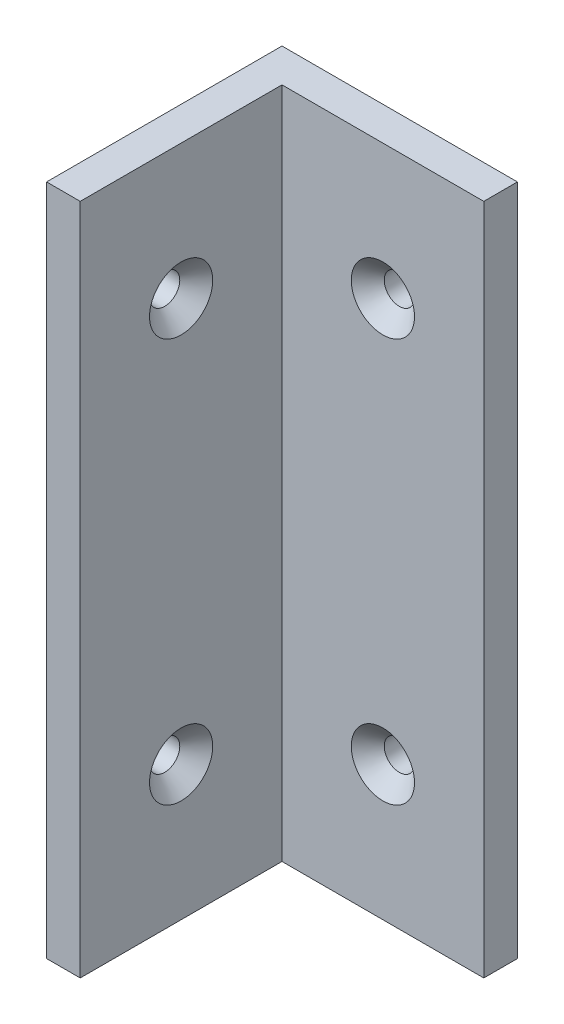
ISO-10303-21;
HEADER;
FILE_DESCRIPTION(('STEP AP214'),'2;1');
FILE_NAME('part.step','',(''),(''),'','','');
FILE_SCHEMA(('AUTOMOTIVE_DESIGN { 1 0 10303 214 1 1 1 1 }'));
ENDSEC;
DATA;
#1=APPLICATION_CONTEXT('core data for automotive mechanical design processes');
#2=APPLICATION_PROTOCOL_DEFINITION('international standard','automotive_design',2000,#1);
#3=PRODUCT_CONTEXT('',#1,'mechanical');
#4=PRODUCT('Part','Part','',(#3));
#5=PRODUCT_RELATED_PRODUCT_CATEGORY('part','',(#4));
#6=PRODUCT_DEFINITION_FORMATION('','',#4);
#7=PRODUCT_DEFINITION_CONTEXT('part definition',#1,'design');
#8=PRODUCT_DEFINITION('design','',#6,#7);
#9=PRODUCT_DEFINITION_SHAPE('','',#8);
#10=(LENGTH_UNIT() NAMED_UNIT(*) SI_UNIT(.MILLI.,.METRE.));
#11=(NAMED_UNIT(*) PLANE_ANGLE_UNIT() SI_UNIT($,.RADIAN.));
#12=(NAMED_UNIT(*) SI_UNIT($,.STERADIAN.) SOLID_ANGLE_UNIT());
#13=UNCERTAINTY_MEASURE_WITH_UNIT(LENGTH_MEASURE(1.E-05),#10,'distance_accuracy_value','');
#14=(GEOMETRIC_REPRESENTATION_CONTEXT(3) GLOBAL_UNCERTAINTY_ASSIGNED_CONTEXT((#13)) GLOBAL_UNIT_ASSIGNED_CONTEXT((#10,
#11,#12)) REPRESENTATION_CONTEXT('',''));
#15=CARTESIAN_POINT('',(0.,0.,0.));
#16=DIRECTION('',(0.,0.,1.));
#17=DIRECTION('',(1.,0.,0.));
#18=AXIS2_PLACEMENT_3D('',#15,#16,#17);
#19=CARTESIAN_POINT('',(15.,80.,4.99999999999545));
#20=DIRECTION('',(0.,0.,1.));
#21=DIRECTION('',(1.,0.,0.));
#22=AXIS2_PLACEMENT_3D('',#19,#20,#21);
#23=CONICAL_SURFACE('',#22,4.70000000000028,0.785398163409049);
#24=CARTESIAN_POINT('',(15.,80.,5.00000000000909));
#25=DIRECTION('',(0.,0.,1.));
#26=DIRECTION('',(1.,0.,0.));
#27=AXIS2_PLACEMENT_3D('',#24,#25,#26);
#28=CIRCLE('',#27,4.70000000001392);
#29=CARTESIAN_POINT('',(19.7000000000139,80.,5.00000000000909));
#30=VERTEX_POINT('',#29);
#31=EDGE_CURVE('E130',#30,#30,#28,.F.);
#32=ORIENTED_EDGE('',*,*,#31,.F.);
#33=EDGE_LOOP('',(#32));
#34=FACE_BOUND('',#33,.T.);
#35=CARTESIAN_POINT('',(15.,80.,2.54999999999999));
#36=DIRECTION('',(0.,0.,1.));
#37=DIRECTION('',(1.,0.,0.));
#38=AXIS2_PLACEMENT_3D('',#35,#36,#37);
#39=CIRCLE('',#38,2.24999999999999);
#40=CARTESIAN_POINT('',(17.25,80.,2.54999999999999));
#41=VERTEX_POINT('',#40);
#42=EDGE_CURVE('E113',#41,#41,#39,.F.);
#43=ORIENTED_EDGE('',*,*,#42,.T.);
#44=EDGE_LOOP('',(#43));
#45=FACE_BOUND('',#44,.T.);
#46=ADVANCED_FACE('F17',(#34,#45),#23,.F.);
#47=CARTESIAN_POINT('',(15.0000000000006,20.,4.99999999999545));
#48=DIRECTION('',(0.,0.,1.));
#49=DIRECTION('',(1.,0.,0.));
#50=AXIS2_PLACEMENT_3D('',#47,#48,#49);
#51=CONICAL_SURFACE('',#50,4.69999999999965,0.785398163409049);
#52=CARTESIAN_POINT('',(15.0000000000006,20.,5.00000000000972));
#53=DIRECTION('',(0.,0.,1.));
#54=DIRECTION('',(1.,0.,0.));
#55=AXIS2_PLACEMENT_3D('',#52,#53,#54);
#56=CIRCLE('',#55,4.70000000001392);
#57=CARTESIAN_POINT('',(19.7000000000145,20.,5.00000000000972));
#58=VERTEX_POINT('',#57);
#59=EDGE_CURVE('E89',#58,#58,#56,.F.);
#60=ORIENTED_EDGE('',*,*,#59,.F.);
#61=EDGE_LOOP('',(#60));
#62=FACE_BOUND('',#61,.T.);
#63=CARTESIAN_POINT('',(15.0000000000006,20.,2.54999999999999));
#64=DIRECTION('',(0.,0.,1.));
#65=DIRECTION('',(1.,0.,0.));
#66=AXIS2_PLACEMENT_3D('',#63,#64,#65);
#67=CIRCLE('',#66,2.24999999999999);
#68=CARTESIAN_POINT('',(17.2500000000006,20.,2.54999999999999));
#69=VERTEX_POINT('',#68);
#70=EDGE_CURVE('E110',#69,#69,#67,.F.);
#71=ORIENTED_EDGE('',*,*,#70,.T.);
#72=EDGE_LOOP('',(#71));
#73=FACE_BOUND('',#72,.T.);
#74=ADVANCED_FACE('F223',(#62,#73),#51,.F.);
#75=CARTESIAN_POINT('',(-5.6843418860808E-11,80.,20.));
#76=DIRECTION('',(1.,0.,0.));
#77=DIRECTION('',(0.,0.,-1.));
#78=AXIS2_PLACEMENT_3D('',#75,#76,#77);
#79=CONICAL_SURFACE('',#78,4.69999999986158,0.785398163409049);
#80=CARTESIAN_POINT('',(3.86496390425477E-11,80.,20.));
#81=DIRECTION('',(1.,0.,0.));
#82=DIRECTION('',(0.,0.,-1.));
#83=AXIS2_PLACEMENT_3D('',#80,#81,#82);
#84=CIRCLE('',#83,4.69999999995707);
#85=CARTESIAN_POINT('',(3.86496390425477E-11,80.,15.3000000000429));
#86=VERTEX_POINT('',#85);
#87=EDGE_CURVE('E20',#86,#86,#84,.T.);
#88=ORIENTED_EDGE('',*,*,#87,.T.);
#89=EDGE_LOOP('',(#88));
#90=FACE_BOUND('',#89,.T.);
#91=CARTESIAN_POINT('',(-2.45000000000001,80.,20.));
#92=DIRECTION('',(1.,0.,0.));
#93=DIRECTION('',(0.,0.,-1.));
#94=AXIS2_PLACEMENT_3D('',#91,#92,#93);
#95=CIRCLE('',#94,2.24999999999999);
#96=CARTESIAN_POINT('',(-2.45000000000001,80.,17.75));
#97=VERTEX_POINT('',#96);
#98=EDGE_CURVE('E102',#97,#97,#95,.F.);
#99=ORIENTED_EDGE('',*,*,#98,.T.);
#100=EDGE_LOOP('',(#99));
#101=FACE_BOUND('',#100,.T.);
#102=ADVANCED_FACE('F139',(#90,#101),#79,.F.);
#103=CARTESIAN_POINT('',(5.6843418860808E-11,20.,19.9999999999994));
#104=DIRECTION('',(1.,0.,0.));
#105=DIRECTION('',(0.,0.,-1.));
#106=AXIS2_PLACEMENT_3D('',#103,#104,#105);
#107=CONICAL_SURFACE('',#106,4.69999999997464,0.785398163385848);
#108=CARTESIAN_POINT('',(5.6843418860808E-11,20.,19.9999999999994));
#109=DIRECTION('',(1.,0.,0.));
#110=DIRECTION('',(0.,0.,-1.));
#111=AXIS2_PLACEMENT_3D('',#108,#109,#110);
#112=CIRCLE('',#111,4.69999999997464);
#113=CARTESIAN_POINT('',(5.6843418860808E-11,20.,15.3000000000247));
#114=VERTEX_POINT('',#113);
#115=EDGE_CURVE('E132',#114,#114,#112,.T.);
#116=ORIENTED_EDGE('',*,*,#115,.T.);
#117=EDGE_LOOP('',(#116));
#118=FACE_BOUND('',#117,.T.);
#119=CARTESIAN_POINT('',(-2.45000000000001,20.,19.9999999999994));
#120=DIRECTION('',(1.,0.,0.));
#121=DIRECTION('',(0.,0.,-1.));
#122=AXIS2_PLACEMENT_3D('',#119,#120,#121);
#123=CIRCLE('',#122,2.24999999999999);
#124=CARTESIAN_POINT('',(-2.45000000000001,20.,17.7499999999994));
#125=VERTEX_POINT('',#124);
#126=EDGE_CURVE('E104',#125,#125,#123,.F.);
#127=ORIENTED_EDGE('',*,*,#126,.T.);
#128=EDGE_LOOP('',(#127));
#129=FACE_BOUND('',#128,.T.);
#130=ADVANCED_FACE('F218',(#118,#129),#107,.F.);
#131=CARTESIAN_POINT('',(15.,80.,5.));
#132=DIRECTION('',(0.,0.,1.));
#133=DIRECTION('',(1.,0.,0.));
#134=AXIS2_PLACEMENT_3D('',#131,#132,#133);
#135=CYLINDRICAL_SURFACE('',#134,2.24999999999999);
#136=CARTESIAN_POINT('',(15.,80.,0.));
#137=DIRECTION('',(0.,0.,1.));
#138=DIRECTION('',(1.,0.,0.));
#139=AXIS2_PLACEMENT_3D('',#136,#137,#138);
#140=CIRCLE('',#139,2.24999999999999);
#141=CARTESIAN_POINT('',(17.25,80.,0.));
#142=VERTEX_POINT('',#141);
#143=EDGE_CURVE('E107',#142,#142,#140,.F.);
#144=ORIENTED_EDGE('',*,*,#143,.T.);
#145=EDGE_LOOP('',(#144));
#146=FACE_BOUND('',#145,.T.);
#147=ORIENTED_EDGE('',*,*,#42,.F.);
#148=EDGE_LOOP('',(#147));
#149=FACE_BOUND('',#148,.T.);
#150=ADVANCED_FACE('F152',(#146,#149),#135,.F.);
#151=CARTESIAN_POINT('',(15.0000000000006,20.,5.));
#152=DIRECTION('',(0.,0.,1.));
#153=DIRECTION('',(1.,0.,0.));
#154=AXIS2_PLACEMENT_3D('',#151,#152,#153);
#155=CYLINDRICAL_SURFACE('',#154,2.24999999999999);
#156=CARTESIAN_POINT('',(15.0000000000006,20.,0.));
#157=DIRECTION('',(0.,0.,1.));
#158=DIRECTION('',(1.,0.,0.));
#159=AXIS2_PLACEMENT_3D('',#156,#157,#158);
#160=CIRCLE('',#159,2.24999999999999);
#161=CARTESIAN_POINT('',(17.2500000000006,20.,0.));
#162=VERTEX_POINT('',#161);
#163=EDGE_CURVE('E101',#162,#162,#160,.F.);
#164=ORIENTED_EDGE('',*,*,#163,.T.);
#165=EDGE_LOOP('',(#164));
#166=FACE_BOUND('',#165,.T.);
#167=ORIENTED_EDGE('',*,*,#70,.F.);
#168=EDGE_LOOP('',(#167));
#169=FACE_BOUND('',#168,.T.);
#170=ADVANCED_FACE('F143',(#166,#169),#155,.F.);
#171=CARTESIAN_POINT('',(0.,0.,35.));
#172=DIRECTION('',(-1.,0.,0.));
#173=DIRECTION('',(0.,0.,1.));
#174=AXIS2_PLACEMENT_3D('',#171,#172,#173);
#175=PLANE('',#174);
#176=DIRECTION('',(0.,1.,0.));
#177=VECTOR('',#176,1.);
#178=CARTESIAN_POINT('',(0.,0.,5.));
#179=LINE('',#178,#177);
#180=CARTESIAN_POINT('',(0.,100.,5.));
#181=VERTEX_POINT('',#180);
#182=CARTESIAN_POINT('',(0.,0.,5.));
#183=VERTEX_POINT('',#182);
#184=EDGE_CURVE('E76',#181,#183,#179,.F.);
#185=ORIENTED_EDGE('',*,*,#184,.F.);
#186=DIRECTION('',(0.,0.,1.));
#187=VECTOR('',#186,1.);
#188=CARTESIAN_POINT('',(0.,100.,5.));
#189=LINE('',#188,#187);
#190=CARTESIAN_POINT('',(0.,100.,35.));
#191=VERTEX_POINT('',#190);
#192=EDGE_CURVE('E195',#191,#181,#189,.F.);
#193=ORIENTED_EDGE('',*,*,#192,.F.);
#194=DIRECTION('',(0.,1.,0.));
#195=VECTOR('',#194,1.);
#196=CARTESIAN_POINT('',(0.,0.,35.));
#197=LINE('',#196,#195);
#198=CARTESIAN_POINT('',(0.,0.,35.));
#199=VERTEX_POINT('',#198);
#200=EDGE_CURVE('E78',#199,#191,#197,.T.);
#201=ORIENTED_EDGE('',*,*,#200,.F.);
#202=DIRECTION('',(0.,0.,1.));
#203=VECTOR('',#202,1.);
#204=CARTESIAN_POINT('',(0.,0.,5.));
#205=LINE('',#204,#203);
#206=EDGE_CURVE('E72',#199,#183,#205,.F.);
#207=ORIENTED_EDGE('',*,*,#206,.T.);
#208=EDGE_LOOP('',(#185,#193,#201,#207));
#209=FACE_BOUND('',#208,.T.);
#210=ORIENTED_EDGE('',*,*,#115,.F.);
#211=EDGE_LOOP('',(#210));
#212=FACE_BOUND('',#211,.T.);
#213=ORIENTED_EDGE('',*,*,#87,.F.);
#214=EDGE_LOOP('',(#213));
#215=FACE_BOUND('',#214,.T.);
#216=ADVANCED_FACE('F73',(#209,#212,#215),#175,.F.);
#217=CARTESIAN_POINT('',(0.,0.,5.));
#218=DIRECTION('',(0.,0.,1.));
#219=DIRECTION('',(1.,0.,0.));
#220=AXIS2_PLACEMENT_3D('',#217,#218,#219);
#221=PLANE('',#220);
#222=DIRECTION('',(1.,0.,0.));
#223=VECTOR('',#222,1.);
#224=CARTESIAN_POINT('',(0.,100.,5.));
#225=LINE('',#224,#223);
#226=CARTESIAN_POINT('',(30.,100.,5.));
#227=VERTEX_POINT('',#226);
#228=EDGE_CURVE('E86',#181,#227,#225,.T.);
#229=ORIENTED_EDGE('',*,*,#228,.F.);
#230=ORIENTED_EDGE('',*,*,#184,.T.);
#231=DIRECTION('',(1.,0.,0.));
#232=VECTOR('',#231,1.);
#233=CARTESIAN_POINT('',(0.,0.,5.));
#234=LINE('',#233,#232);
#235=CARTESIAN_POINT('',(30.,0.,5.));
#236=VERTEX_POINT('',#235);
#237=EDGE_CURVE('E67',#183,#236,#234,.T.);
#238=ORIENTED_EDGE('',*,*,#237,.T.);
#239=DIRECTION('',(0.,-1.,0.));
#240=VECTOR('',#239,1.);
#241=CARTESIAN_POINT('',(30.,0.,5.));
#242=LINE('',#241,#240);
#243=EDGE_CURVE('E88',#236,#227,#242,.F.);
#244=ORIENTED_EDGE('',*,*,#243,.T.);
#245=EDGE_LOOP('',(#229,#230,#238,#244));
#246=FACE_BOUND('',#245,.T.);
#247=ORIENTED_EDGE('',*,*,#59,.T.);
#248=EDGE_LOOP('',(#247));
#249=FACE_BOUND('',#248,.T.);
#250=ORIENTED_EDGE('',*,*,#31,.T.);
#251=EDGE_LOOP('',(#250));
#252=FACE_BOUND('',#251,.T.);
#253=ADVANCED_FACE('F83',(#246,#249,#252),#221,.T.);
#254=CARTESIAN_POINT('',(30.,0.,5.));
#255=DIRECTION('',(-1.,0.,0.));
#256=DIRECTION('',(0.,-1.,0.));
#257=AXIS2_PLACEMENT_3D('',#254,#255,#256);
#258=PLANE('',#257);
#259=DIRECTION('',(0.,0.,1.));
#260=VECTOR('',#259,1.);
#261=CARTESIAN_POINT('',(30.,100.,5.));
#262=LINE('',#261,#260);
#263=CARTESIAN_POINT('',(30.,100.,0.));
#264=VERTEX_POINT('',#263);
#265=EDGE_CURVE('E123',#227,#264,#262,.F.);
#266=ORIENTED_EDGE('',*,*,#265,.F.);
#267=ORIENTED_EDGE('',*,*,#243,.F.);
#268=DIRECTION('',(0.,0.,1.));
#269=VECTOR('',#268,1.);
#270=CARTESIAN_POINT('',(30.,0.,5.));
#271=LINE('',#270,#269);
#272=CARTESIAN_POINT('',(30.,0.,0.));
#273=VERTEX_POINT('',#272);
#274=EDGE_CURVE('E94',#236,#273,#271,.F.);
#275=ORIENTED_EDGE('',*,*,#274,.T.);
#276=DIRECTION('',(0.,1.,0.));
#277=VECTOR('',#276,1.);
#278=CARTESIAN_POINT('',(30.,0.,0.));
#279=LINE('',#278,#277);
#280=EDGE_CURVE('E81',#273,#264,#279,.T.);
#281=ORIENTED_EDGE('',*,*,#280,.T.);
#282=EDGE_LOOP('',(#266,#267,#275,#281));
#283=FACE_BOUND('',#282,.T.);
#284=ADVANCED_FACE('F150',(#283),#258,.F.);
#285=CARTESIAN_POINT('',(0.,80.,20.));
#286=DIRECTION('',(1.,0.,0.));
#287=DIRECTION('',(0.,0.,-1.));
#288=AXIS2_PLACEMENT_3D('',#285,#286,#287);
#289=CYLINDRICAL_SURFACE('',#288,2.24999999999999);
#290=ORIENTED_EDGE('',*,*,#98,.F.);
#291=EDGE_LOOP('',(#290));
#292=FACE_BOUND('',#291,.T.);
#293=CARTESIAN_POINT('',(-5.,80.,20.));
#294=DIRECTION('',(1.,0.,0.));
#295=DIRECTION('',(0.,0.,-1.));
#296=AXIS2_PLACEMENT_3D('',#293,#294,#295);
#297=CIRCLE('',#296,2.24999999999999);
#298=CARTESIAN_POINT('',(-5.,80.,17.75));
#299=VERTEX_POINT('',#298);
#300=EDGE_CURVE('E120',#299,#299,#297,.T.);
#301=ORIENTED_EDGE('',*,*,#300,.F.);
#302=EDGE_LOOP('',(#301));
#303=FACE_BOUND('',#302,.T.);
#304=ADVANCED_FACE('F180',(#292,#303),#289,.F.);
#305=CARTESIAN_POINT('',(0.,20.,19.9999999999994));
#306=DIRECTION('',(1.,0.,0.));
#307=DIRECTION('',(0.,0.,-1.));
#308=AXIS2_PLACEMENT_3D('',#305,#306,#307);
#309=CYLINDRICAL_SURFACE('',#308,2.24999999999999);
#310=ORIENTED_EDGE('',*,*,#126,.F.);
#311=EDGE_LOOP('',(#310));
#312=FACE_BOUND('',#311,.T.);
#313=CARTESIAN_POINT('',(-5.,20.,19.9999999999994));
#314=DIRECTION('',(1.,0.,0.));
#315=DIRECTION('',(0.,0.,-1.));
#316=AXIS2_PLACEMENT_3D('',#313,#314,#315);
#317=CIRCLE('',#316,2.24999999999999);
#318=CARTESIAN_POINT('',(-5.,20.,17.7499999999994));
#319=VERTEX_POINT('',#318);
#320=EDGE_CURVE('E116',#319,#319,#317,.T.);
#321=ORIENTED_EDGE('',*,*,#320,.F.);
#322=EDGE_LOOP('',(#321));
#323=FACE_BOUND('',#322,.T.);
#324=ADVANCED_FACE('F176',(#312,#323),#309,.F.);
#325=CARTESIAN_POINT('',(0.,0.,0.));
#326=DIRECTION('',(0.,0.,1.));
#327=DIRECTION('',(1.,0.,0.));
#328=AXIS2_PLACEMENT_3D('',#325,#326,#327);
#329=PLANE('',#328);
#330=DIRECTION('',(0.,1.,0.));
#331=VECTOR('',#330,1.);
#332=CARTESIAN_POINT('',(-5.,0.,0.));
#333=LINE('',#332,#331);
#334=CARTESIAN_POINT('',(-5.,100.,0.));
#335=VERTEX_POINT('',#334);
#336=CARTESIAN_POINT('',(-5.,0.,0.));
#337=VERTEX_POINT('',#336);
#338=EDGE_CURVE('E119',#335,#337,#333,.F.);
#339=ORIENTED_EDGE('',*,*,#338,.F.);
#340=DIRECTION('',(1.,0.,0.));
#341=VECTOR('',#340,1.);
#342=CARTESIAN_POINT('',(0.,100.,0.));
#343=LINE('',#342,#341);
#344=EDGE_CURVE('E201',#264,#335,#343,.F.);
#345=ORIENTED_EDGE('',*,*,#344,.F.);
#346=ORIENTED_EDGE('',*,*,#280,.F.);
#347=DIRECTION('',(1.,0.,0.));
#348=VECTOR('',#347,1.);
#349=CARTESIAN_POINT('',(0.,0.,0.));
#350=LINE('',#349,#348);
#351=EDGE_CURVE('E96',#273,#337,#350,.F.);
#352=ORIENTED_EDGE('',*,*,#351,.T.);
#353=EDGE_LOOP('',(#339,#345,#346,#352));
#354=FACE_BOUND('',#353,.T.);
#355=ORIENTED_EDGE('',*,*,#163,.F.);
#356=EDGE_LOOP('',(#355));
#357=FACE_BOUND('',#356,.T.);
#358=ORIENTED_EDGE('',*,*,#143,.F.);
#359=EDGE_LOOP('',(#358));
#360=FACE_BOUND('',#359,.T.);
#361=ADVANCED_FACE('F173',(#354,#357,#360),#329,.F.);
#362=CARTESIAN_POINT('',(0.,0.,5.));
#363=DIRECTION('',(0.,1.,0.));
#364=DIRECTION('',(0.,0.,1.));
#365=AXIS2_PLACEMENT_3D('',#362,#363,#364);
#366=PLANE('',#365);
#367=ORIENTED_EDGE('',*,*,#274,.F.);
#368=ORIENTED_EDGE('',*,*,#237,.F.);
#369=ORIENTED_EDGE('',*,*,#206,.F.);
#370=DIRECTION('',(1.,0.,0.));
#371=VECTOR('',#370,1.);
#372=CARTESIAN_POINT('',(0.,0.,35.));
#373=LINE('',#372,#371);
#374=CARTESIAN_POINT('',(-5.,0.,35.));
#375=VERTEX_POINT('',#374);
#376=EDGE_CURVE('E204',#375,#199,#373,.T.);
#377=ORIENTED_EDGE('',*,*,#376,.F.);
#378=DIRECTION('',(0.,0.,1.));
#379=VECTOR('',#378,1.);
#380=CARTESIAN_POINT('',(-5.,0.,35.));
#381=LINE('',#380,#379);
#382=EDGE_CURVE('E209',#337,#375,#381,.T.);
#383=ORIENTED_EDGE('',*,*,#382,.F.);
#384=ORIENTED_EDGE('',*,*,#351,.F.);
#385=EDGE_LOOP('',(#367,#368,#369,#377,#383,#384));
#386=FACE_BOUND('',#385,.T.);
#387=ADVANCED_FACE('F92',(#386),#366,.F.);
#388=CARTESIAN_POINT('',(0.,0.,35.));
#389=DIRECTION('',(0.,0.,1.));
#390=DIRECTION('',(1.,0.,0.));
#391=AXIS2_PLACEMENT_3D('',#388,#389,#390);
#392=PLANE('',#391);
#393=ORIENTED_EDGE('',*,*,#200,.T.);
#394=DIRECTION('',(1.,0.,0.));
#395=VECTOR('',#394,1.);
#396=CARTESIAN_POINT('',(0.,100.,35.));
#397=LINE('',#396,#395);
#398=CARTESIAN_POINT('',(-5.,100.,35.));
#399=VERTEX_POINT('',#398);
#400=EDGE_CURVE('E35',#399,#191,#397,.T.);
#401=ORIENTED_EDGE('',*,*,#400,.F.);
#402=DIRECTION('',(0.,1.,0.));
#403=VECTOR('',#402,1.);
#404=CARTESIAN_POINT('',(-5.,0.,35.));
#405=LINE('',#404,#403);
#406=EDGE_CURVE('E26',#375,#399,#405,.T.);
#407=ORIENTED_EDGE('',*,*,#406,.F.);
#408=ORIENTED_EDGE('',*,*,#376,.T.);
#409=EDGE_LOOP('',(#393,#401,#407,#408));
#410=FACE_BOUND('',#409,.T.);
#411=ADVANCED_FACE('F163',(#410),#392,.T.);
#412=CARTESIAN_POINT('',(0.,100.,5.));
#413=DIRECTION('',(0.,1.,0.));
#414=DIRECTION('',(0.,0.,1.));
#415=AXIS2_PLACEMENT_3D('',#412,#413,#414);
#416=PLANE('',#415);
#417=ORIENTED_EDGE('',*,*,#228,.T.);
#418=ORIENTED_EDGE('',*,*,#265,.T.);
#419=ORIENTED_EDGE('',*,*,#344,.T.);
#420=DIRECTION('',(0.,0.,1.));
#421=VECTOR('',#420,1.);
#422=CARTESIAN_POINT('',(-5.,100.,35.));
#423=LINE('',#422,#421);
#424=EDGE_CURVE('E11',#399,#335,#423,.F.);
#425=ORIENTED_EDGE('',*,*,#424,.F.);
#426=ORIENTED_EDGE('',*,*,#400,.T.);
#427=ORIENTED_EDGE('',*,*,#192,.T.);
#428=EDGE_LOOP('',(#417,#418,#419,#425,#426,#427));
#429=FACE_BOUND('',#428,.T.);
#430=ADVANCED_FACE('F157',(#429),#416,.T.);
#431=CARTESIAN_POINT('',(-5.,0.,35.));
#432=DIRECTION('',(-1.,0.,0.));
#433=DIRECTION('',(0.,0.,1.));
#434=AXIS2_PLACEMENT_3D('',#431,#432,#433);
#435=PLANE('',#434);
#436=ORIENTED_EDGE('',*,*,#406,.T.);
#437=ORIENTED_EDGE('',*,*,#424,.T.);
#438=ORIENTED_EDGE('',*,*,#338,.T.);
#439=ORIENTED_EDGE('',*,*,#382,.T.);
#440=EDGE_LOOP('',(#436,#437,#438,#439));
#441=FACE_BOUND('',#440,.T.);
#442=ORIENTED_EDGE('',*,*,#320,.T.);
#443=EDGE_LOOP('',(#442));
#444=FACE_BOUND('',#443,.T.);
#445=ORIENTED_EDGE('',*,*,#300,.T.);
#446=EDGE_LOOP('',(#445));
#447=FACE_BOUND('',#446,.T.);
#448=ADVANCED_FACE('F155',(#441,#444,#447),#435,.T.);
#449=CLOSED_SHELL('',(#46,#74,#102,#130,#150,#170,#216,#253,#284,#304,#324,#361,#387,#411,#430,#448));
#450=MANIFOLD_SOLID_BREP('B1',#449);
#451=ADVANCED_BREP_SHAPE_REPRESENTATION('',(#18,#450),#14);
#452=SHAPE_DEFINITION_REPRESENTATION(#9,#451);
ENDSEC;
END-ISO-10303-21;
